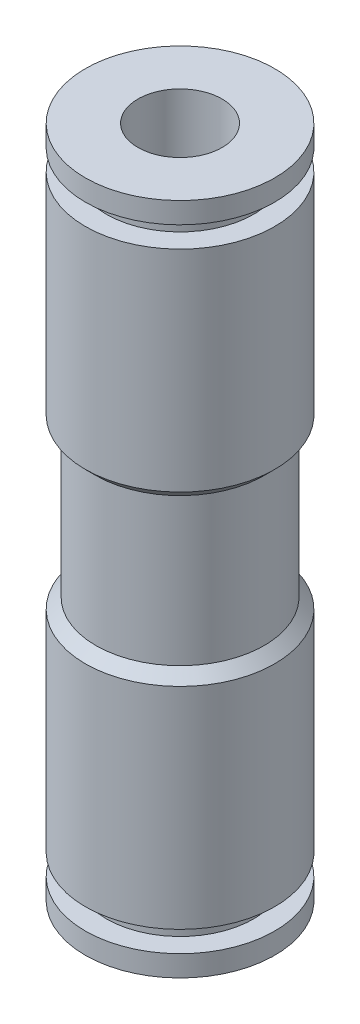
ISO-10303-21;
HEADER;
FILE_DESCRIPTION(('STEP AP214'),'2;1');
FILE_NAME('part.step','',(''),(''),'','','');
FILE_SCHEMA(('AUTOMOTIVE_DESIGN { 1 0 10303 214 1 1 1 1 }'));
ENDSEC;
DATA;
#1=APPLICATION_CONTEXT('core data for automotive mechanical design processes');
#2=APPLICATION_PROTOCOL_DEFINITION('international standard','automotive_design',2000,#1);
#3=PRODUCT_CONTEXT('',#1,'mechanical');
#4=PRODUCT('Part','Part','',(#3));
#5=PRODUCT_RELATED_PRODUCT_CATEGORY('part','',(#4));
#6=PRODUCT_DEFINITION_FORMATION('','',#4);
#7=PRODUCT_DEFINITION_CONTEXT('part definition',#1,'design');
#8=PRODUCT_DEFINITION('design','',#6,#7);
#9=PRODUCT_DEFINITION_SHAPE('','',#8);
#10=(LENGTH_UNIT() NAMED_UNIT(*) SI_UNIT(.MILLI.,.METRE.));
#11=(NAMED_UNIT(*) PLANE_ANGLE_UNIT() SI_UNIT($,.RADIAN.));
#12=(NAMED_UNIT(*) SI_UNIT($,.STERADIAN.) SOLID_ANGLE_UNIT());
#13=UNCERTAINTY_MEASURE_WITH_UNIT(LENGTH_MEASURE(1.E-05),#10,'distance_accuracy_value','');
#14=(GEOMETRIC_REPRESENTATION_CONTEXT(3) GLOBAL_UNCERTAINTY_ASSIGNED_CONTEXT((#13)) GLOBAL_UNIT_ASSIGNED_CONTEXT((#10,
#11,#12)) REPRESENTATION_CONTEXT('',''));
#15=CARTESIAN_POINT('',(0.,0.,0.));
#16=DIRECTION('',(0.,0.,1.));
#17=DIRECTION('',(1.,0.,0.));
#18=AXIS2_PLACEMENT_3D('',#15,#16,#17);
#19=CARTESIAN_POINT('',(0.,64.6275950219298,0.));
#20=DIRECTION('',(0.,1.,0.));
#21=DIRECTION('',(0.,0.,1.));
#22=AXIS2_PLACEMENT_3D('',#19,#20,#21);
#23=CYLINDRICAL_SURFACE('',#22,4.50000000000001);
#24=CARTESIAN_POINT('',(0.,16.,0.));
#25=DIRECTION('',(0.,1.,0.));
#26=DIRECTION('',(0.,0.,1.));
#27=AXIS2_PLACEMENT_3D('',#24,#25,#26);
#28=CIRCLE('',#27,4.50000000000001);
#29=CARTESIAN_POINT('',(0.,16.,4.50000000000001));
#30=VERTEX_POINT('',#29);
#31=EDGE_CURVE('E64',#30,#30,#28,.T.);
#32=ORIENTED_EDGE('',*,*,#31,.F.);
#33=EDGE_LOOP('',(#32));
#34=FACE_BOUND('',#33,.T.);
#35=CARTESIAN_POINT('',(0.,15.,0.));
#36=DIRECTION('',(0.,1.,0.));
#37=DIRECTION('',(0.,0.,1.));
#38=AXIS2_PLACEMENT_3D('',#35,#36,#37);
#39=CIRCLE('',#38,4.50000000000001);
#40=CARTESIAN_POINT('',(0.,15.,4.50000000000001));
#41=VERTEX_POINT('',#40);
#42=EDGE_CURVE('E10',#41,#41,#39,.T.);
#43=ORIENTED_EDGE('',*,*,#42,.T.);
#44=EDGE_LOOP('',(#43));
#45=FACE_BOUND('',#44,.T.);
#46=ADVANCED_FACE('F36',(#34,#45),#23,.T.);
#47=CARTESIAN_POINT('',(4.50000000000001,15.,0.));
#48=DIRECTION('',(0.,1.,0.));
#49=DIRECTION('',(0.,0.,1.));
#50=AXIS2_PLACEMENT_3D('',#47,#48,#49);
#51=PLANE('',#50);
#52=ORIENTED_EDGE('',*,*,#42,.F.);
#53=EDGE_LOOP('',(#52));
#54=FACE_BOUND('',#53,.T.);
#55=CARTESIAN_POINT('',(0.,15.,0.));
#56=DIRECTION('',(0.,1.,0.));
#57=DIRECTION('',(0.,0.,1.));
#58=AXIS2_PLACEMENT_3D('',#55,#56,#57);
#59=CIRCLE('',#58,3.50000000000001);
#60=CARTESIAN_POINT('',(0.,15.,3.50000000000001));
#61=VERTEX_POINT('',#60);
#62=EDGE_CURVE('E42',#61,#61,#59,.T.);
#63=ORIENTED_EDGE('',*,*,#62,.T.);
#64=EDGE_LOOP('',(#63));
#65=FACE_BOUND('',#64,.T.);
#66=ADVANCED_FACE('F107',(#54,#65),#51,.F.);
#67=CARTESIAN_POINT('',(0.,64.6275950219298,0.));
#68=DIRECTION('',(0.,1.,0.));
#69=DIRECTION('',(0.,0.,1.));
#70=AXIS2_PLACEMENT_3D('',#67,#68,#69);
#71=CYLINDRICAL_SURFACE('',#70,3.50000000000001);
#72=ORIENTED_EDGE('',*,*,#62,.F.);
#73=EDGE_LOOP('',(#72));
#74=FACE_BOUND('',#73,.T.);
#75=CARTESIAN_POINT('',(0.,14.,0.));
#76=DIRECTION('',(0.,1.,0.));
#77=DIRECTION('',(0.,0.,1.));
#78=AXIS2_PLACEMENT_3D('',#75,#76,#77);
#79=CIRCLE('',#78,3.50000000000001);
#80=CARTESIAN_POINT('',(0.,14.,3.50000000000001));
#81=VERTEX_POINT('',#80);
#82=EDGE_CURVE('E46',#81,#81,#79,.T.);
#83=ORIENTED_EDGE('',*,*,#82,.T.);
#84=EDGE_LOOP('',(#83));
#85=FACE_BOUND('',#84,.T.);
#86=ADVANCED_FACE('F112',(#74,#85),#71,.T.);
#87=CARTESIAN_POINT('',(3.50000000000001,14.,0.));
#88=DIRECTION('',(0.,-1.,0.));
#89=DIRECTION('',(0.,0.,-1.));
#90=AXIS2_PLACEMENT_3D('',#87,#88,#89);
#91=PLANE('',#90);
#92=ORIENTED_EDGE('',*,*,#82,.F.);
#93=EDGE_LOOP('',(#92));
#94=FACE_BOUND('',#93,.T.);
#95=CARTESIAN_POINT('',(0.,14.,0.));
#96=DIRECTION('',(0.,1.,0.));
#97=DIRECTION('',(0.,0.,1.));
#98=AXIS2_PLACEMENT_3D('',#95,#96,#97);
#99=CIRCLE('',#98,4.50000000000001);
#100=CARTESIAN_POINT('',(0.,14.,4.50000000000001));
#101=VERTEX_POINT('',#100);
#102=EDGE_CURVE('E50',#101,#101,#99,.T.);
#103=ORIENTED_EDGE('',*,*,#102,.T.);
#104=EDGE_LOOP('',(#103));
#105=FACE_BOUND('',#104,.T.);
#106=ADVANCED_FACE('F143',(#94,#105),#91,.F.);
#107=CARTESIAN_POINT('',(0.,64.6275950219298,0.));
#108=DIRECTION('',(0.,1.,0.));
#109=DIRECTION('',(0.,0.,1.));
#110=AXIS2_PLACEMENT_3D('',#107,#108,#109);
#111=CYLINDRICAL_SURFACE('',#110,4.50000000000001);
#112=ORIENTED_EDGE('',*,*,#102,.F.);
#113=EDGE_LOOP('',(#112));
#114=FACE_BOUND('',#113,.T.);
#115=CARTESIAN_POINT('',(0.,4.,0.));
#116=DIRECTION('',(0.,1.,0.));
#117=DIRECTION('',(0.,0.,1.));
#118=AXIS2_PLACEMENT_3D('',#115,#116,#117);
#119=CIRCLE('',#118,4.50000000000001);
#120=CARTESIAN_POINT('',(0.,4.,4.50000000000001));
#121=VERTEX_POINT('',#120);
#122=EDGE_CURVE('E55',#121,#121,#119,.T.);
#123=ORIENTED_EDGE('',*,*,#122,.T.);
#124=EDGE_LOOP('',(#123));
#125=FACE_BOUND('',#124,.T.);
#126=ADVANCED_FACE('F139',(#114,#125),#111,.T.);
#127=CARTESIAN_POINT('',(0.,3.5,0.));
#128=DIRECTION('',(0.,1.,0.));
#129=DIRECTION('',(0.,0.,1.));
#130=AXIS2_PLACEMENT_3D('',#127,#128,#129);
#131=CONICAL_SURFACE('',#130,4.00000000000001,0.785398163397454);
#132=ORIENTED_EDGE('',*,*,#122,.F.);
#133=EDGE_LOOP('',(#132));
#134=FACE_BOUND('',#133,.T.);
#135=CARTESIAN_POINT('',(0.,3.5,0.));
#136=DIRECTION('',(0.,1.,0.));
#137=DIRECTION('',(0.,0.,1.));
#138=AXIS2_PLACEMENT_3D('',#135,#136,#137);
#139=CIRCLE('',#138,4.00000000000001);
#140=CARTESIAN_POINT('',(0.,3.5,4.00000000000001));
#141=VERTEX_POINT('',#140);
#142=EDGE_CURVE('E58',#141,#141,#139,.T.);
#143=ORIENTED_EDGE('',*,*,#142,.T.);
#144=EDGE_LOOP('',(#143));
#145=FACE_BOUND('',#144,.T.);
#146=ADVANCED_FACE('F135',(#134,#145),#131,.T.);
#147=CARTESIAN_POINT('',(0.,64.6275950219298,0.));
#148=DIRECTION('',(0.,1.,0.));
#149=DIRECTION('',(0.,0.,1.));
#150=AXIS2_PLACEMENT_3D('',#147,#148,#149);
#151=CYLINDRICAL_SURFACE('',#150,4.00000000000001);
#152=ORIENTED_EDGE('',*,*,#142,.F.);
#153=EDGE_LOOP('',(#152));
#154=FACE_BOUND('',#153,.T.);
#155=CARTESIAN_POINT('',(0.,-3.5,0.));
#156=DIRECTION('',(0.,1.,0.));
#157=DIRECTION('',(0.,0.,1.));
#158=AXIS2_PLACEMENT_3D('',#155,#156,#157);
#159=CIRCLE('',#158,4.00000000000001);
#160=CARTESIAN_POINT('',(0.,-3.5,4.00000000000001));
#161=VERTEX_POINT('',#160);
#162=EDGE_CURVE('E82',#161,#161,#159,.T.);
#163=ORIENTED_EDGE('',*,*,#162,.T.);
#164=EDGE_LOOP('',(#163));
#165=FACE_BOUND('',#164,.T.);
#166=ADVANCED_FACE('F127',(#154,#165),#151,.T.);
#167=CARTESIAN_POINT('',(0.,64.6275950219298,0.));
#168=DIRECTION('',(0.,1.,0.));
#169=DIRECTION('',(0.,0.,1.));
#170=AXIS2_PLACEMENT_3D('',#167,#168,#169);
#171=CYLINDRICAL_SURFACE('',#170,2.00000000000001);
#172=CARTESIAN_POINT('',(0.,16.,0.));
#173=DIRECTION('',(0.,1.,0.));
#174=DIRECTION('',(0.,0.,1.));
#175=AXIS2_PLACEMENT_3D('',#172,#173,#174);
#176=CIRCLE('',#175,2.00000000000001);
#177=CARTESIAN_POINT('',(0.,16.,2.00000000000001));
#178=VERTEX_POINT('',#177);
#179=EDGE_CURVE('E61',#178,#178,#176,.T.);
#180=ORIENTED_EDGE('',*,*,#179,.T.);
#181=EDGE_LOOP('',(#180));
#182=FACE_BOUND('',#181,.T.);
#183=CARTESIAN_POINT('',(0.,-16.,0.));
#184=DIRECTION('',(0.,1.,0.));
#185=DIRECTION('',(0.,0.,1.));
#186=AXIS2_PLACEMENT_3D('',#183,#184,#185);
#187=CIRCLE('',#186,2.00000000000001);
#188=CARTESIAN_POINT('',(0.,-16.,2.00000000000001));
#189=VERTEX_POINT('',#188);
#190=EDGE_CURVE('E85',#189,#189,#187,.T.);
#191=ORIENTED_EDGE('',*,*,#190,.F.);
#192=EDGE_LOOP('',(#191));
#193=FACE_BOUND('',#192,.T.);
#194=ADVANCED_FACE('F118',(#182,#193),#171,.F.);
#195=CARTESIAN_POINT('',(4.50000000000001,16.,0.));
#196=DIRECTION('',(0.,-1.,0.));
#197=DIRECTION('',(0.,0.,-1.));
#198=AXIS2_PLACEMENT_3D('',#195,#196,#197);
#199=PLANE('',#198);
#200=ORIENTED_EDGE('',*,*,#179,.F.);
#201=EDGE_LOOP('',(#200));
#202=FACE_BOUND('',#201,.T.);
#203=ORIENTED_EDGE('',*,*,#31,.T.);
#204=EDGE_LOOP('',(#203));
#205=FACE_BOUND('',#204,.T.);
#206=ADVANCED_FACE('F116',(#202,#205),#199,.F.);
#207=CARTESIAN_POINT('',(0.,-64.6275950219298,0.));
#208=DIRECTION('',(0.,-1.,0.));
#209=DIRECTION('',(0.,0.,1.));
#210=AXIS2_PLACEMENT_3D('',#207,#208,#209);
#211=CYLINDRICAL_SURFACE('',#210,4.50000000000001);
#212=CARTESIAN_POINT('',(0.,-16.,0.));
#213=DIRECTION('',(0.,1.,0.));
#214=DIRECTION('',(0.,0.,1.));
#215=AXIS2_PLACEMENT_3D('',#212,#213,#214);
#216=CIRCLE('',#215,4.50000000000001);
#217=CARTESIAN_POINT('',(0.,-16.,4.50000000000001));
#218=VERTEX_POINT('',#217);
#219=EDGE_CURVE('E88',#218,#218,#216,.T.);
#220=ORIENTED_EDGE('',*,*,#219,.T.);
#221=EDGE_LOOP('',(#220));
#222=FACE_BOUND('',#221,.T.);
#223=CARTESIAN_POINT('',(0.,-15.,0.));
#224=DIRECTION('',(0.,1.,0.));
#225=DIRECTION('',(0.,0.,1.));
#226=AXIS2_PLACEMENT_3D('',#223,#224,#225);
#227=CIRCLE('',#226,4.50000000000001);
#228=CARTESIAN_POINT('',(0.,-15.,4.50000000000001));
#229=VERTEX_POINT('',#228);
#230=EDGE_CURVE('E67',#229,#229,#227,.T.);
#231=ORIENTED_EDGE('',*,*,#230,.F.);
#232=EDGE_LOOP('',(#231));
#233=FACE_BOUND('',#232,.T.);
#234=ADVANCED_FACE('F92',(#222,#233),#211,.T.);
#235=CARTESIAN_POINT('',(4.50000000000001,-15.,0.));
#236=DIRECTION('',(0.,-1.,0.));
#237=DIRECTION('',(0.,0.,1.));
#238=AXIS2_PLACEMENT_3D('',#235,#236,#237);
#239=PLANE('',#238);
#240=ORIENTED_EDGE('',*,*,#230,.T.);
#241=EDGE_LOOP('',(#240));
#242=FACE_BOUND('',#241,.T.);
#243=CARTESIAN_POINT('',(0.,-15.,0.));
#244=DIRECTION('',(0.,1.,0.));
#245=DIRECTION('',(0.,0.,1.));
#246=AXIS2_PLACEMENT_3D('',#243,#244,#245);
#247=CIRCLE('',#246,3.50000000000001);
#248=CARTESIAN_POINT('',(0.,-15.,3.50000000000001));
#249=VERTEX_POINT('',#248);
#250=EDGE_CURVE('E70',#249,#249,#247,.T.);
#251=ORIENTED_EDGE('',*,*,#250,.F.);
#252=EDGE_LOOP('',(#251));
#253=FACE_BOUND('',#252,.T.);
#254=ADVANCED_FACE('F125',(#242,#253),#239,.F.);
#255=CARTESIAN_POINT('',(0.,-64.6275950219298,0.));
#256=DIRECTION('',(0.,-1.,0.));
#257=DIRECTION('',(0.,0.,1.));
#258=AXIS2_PLACEMENT_3D('',#255,#256,#257);
#259=CYLINDRICAL_SURFACE('',#258,3.50000000000001);
#260=ORIENTED_EDGE('',*,*,#250,.T.);
#261=EDGE_LOOP('',(#260));
#262=FACE_BOUND('',#261,.T.);
#263=CARTESIAN_POINT('',(0.,-14.,0.));
#264=DIRECTION('',(0.,1.,0.));
#265=DIRECTION('',(0.,0.,1.));
#266=AXIS2_PLACEMENT_3D('',#263,#264,#265);
#267=CIRCLE('',#266,3.50000000000001);
#268=CARTESIAN_POINT('',(0.,-14.,3.50000000000001));
#269=VERTEX_POINT('',#268);
#270=EDGE_CURVE('E73',#269,#269,#267,.T.);
#271=ORIENTED_EDGE('',*,*,#270,.F.);
#272=EDGE_LOOP('',(#271));
#273=FACE_BOUND('',#272,.T.);
#274=ADVANCED_FACE('F206',(#262,#273),#259,.T.);
#275=CARTESIAN_POINT('',(3.50000000000001,-14.,0.));
#276=DIRECTION('',(0.,1.,0.));
#277=DIRECTION('',(0.,0.,-1.));
#278=AXIS2_PLACEMENT_3D('',#275,#276,#277);
#279=PLANE('',#278);
#280=ORIENTED_EDGE('',*,*,#270,.T.);
#281=EDGE_LOOP('',(#280));
#282=FACE_BOUND('',#281,.T.);
#283=CARTESIAN_POINT('',(0.,-14.,0.));
#284=DIRECTION('',(0.,1.,0.));
#285=DIRECTION('',(0.,0.,1.));
#286=AXIS2_PLACEMENT_3D('',#283,#284,#285);
#287=CIRCLE('',#286,4.50000000000001);
#288=CARTESIAN_POINT('',(0.,-14.,4.50000000000001));
#289=VERTEX_POINT('',#288);
#290=EDGE_CURVE('E76',#289,#289,#287,.T.);
#291=ORIENTED_EDGE('',*,*,#290,.F.);
#292=EDGE_LOOP('',(#291));
#293=FACE_BOUND('',#292,.T.);
#294=ADVANCED_FACE('F228',(#282,#293),#279,.F.);
#295=CARTESIAN_POINT('',(0.,-64.6275950219298,0.));
#296=DIRECTION('',(0.,-1.,0.));
#297=DIRECTION('',(0.,0.,1.));
#298=AXIS2_PLACEMENT_3D('',#295,#296,#297);
#299=CYLINDRICAL_SURFACE('',#298,4.50000000000001);
#300=ORIENTED_EDGE('',*,*,#290,.T.);
#301=EDGE_LOOP('',(#300));
#302=FACE_BOUND('',#301,.T.);
#303=CARTESIAN_POINT('',(0.,-4.,0.));
#304=DIRECTION('',(0.,1.,0.));
#305=DIRECTION('',(0.,0.,1.));
#306=AXIS2_PLACEMENT_3D('',#303,#304,#305);
#307=CIRCLE('',#306,4.50000000000001);
#308=CARTESIAN_POINT('',(0.,-4.,4.50000000000001));
#309=VERTEX_POINT('',#308);
#310=EDGE_CURVE('E79',#309,#309,#307,.T.);
#311=ORIENTED_EDGE('',*,*,#310,.F.);
#312=EDGE_LOOP('',(#311));
#313=FACE_BOUND('',#312,.T.);
#314=ADVANCED_FACE('F103',(#302,#313),#299,.T.);
#315=CARTESIAN_POINT('',(0.,-3.5,0.));
#316=DIRECTION('',(0.,-1.,0.));
#317=DIRECTION('',(0.,0.,1.));
#318=AXIS2_PLACEMENT_3D('',#315,#316,#317);
#319=CONICAL_SURFACE('',#318,4.00000000000001,0.785398163397454);
#320=ORIENTED_EDGE('',*,*,#310,.T.);
#321=EDGE_LOOP('',(#320));
#322=FACE_BOUND('',#321,.T.);
#323=ORIENTED_EDGE('',*,*,#162,.F.);
#324=EDGE_LOOP('',(#323));
#325=FACE_BOUND('',#324,.T.);
#326=ADVANCED_FACE('F97',(#322,#325),#319,.T.);
#327=CARTESIAN_POINT('',(4.50000000000001,-16.,0.));
#328=DIRECTION('',(0.,1.,0.));
#329=DIRECTION('',(0.,0.,-1.));
#330=AXIS2_PLACEMENT_3D('',#327,#328,#329);
#331=PLANE('',#330);
#332=ORIENTED_EDGE('',*,*,#190,.T.);
#333=EDGE_LOOP('',(#332));
#334=FACE_BOUND('',#333,.T.);
#335=ORIENTED_EDGE('',*,*,#219,.F.);
#336=EDGE_LOOP('',(#335));
#337=FACE_BOUND('',#336,.T.);
#338=ADVANCED_FACE('F95',(#334,#337),#331,.F.);
#339=CLOSED_SHELL('',(#46,#66,#86,#106,#126,#146,#166,#194,#206,#234,#254,#274,#294,#314,#326,#338));
#340=MANIFOLD_SOLID_BREP('B2',#339);
#341=ADVANCED_BREP_SHAPE_REPRESENTATION('',(#18,#340),#14);
#342=SHAPE_DEFINITION_REPRESENTATION(#9,#341);
ENDSEC;
END-ISO-10303-21;
